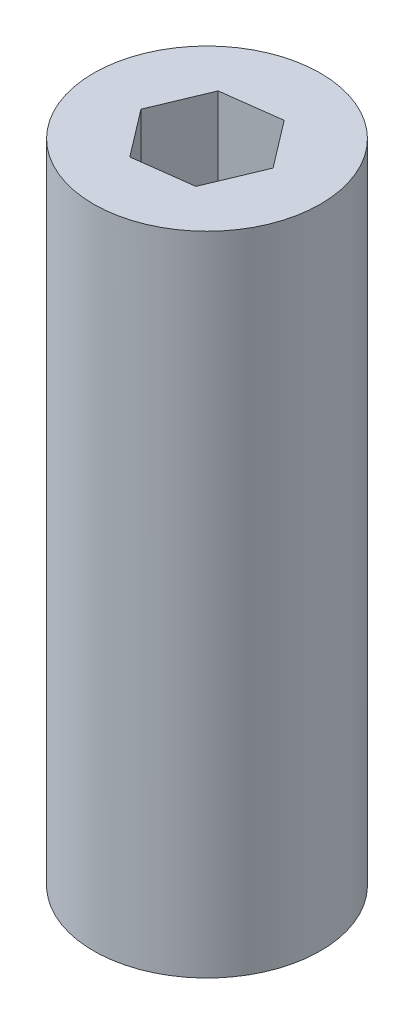
ISO-10303-21;
HEADER;
FILE_DESCRIPTION(('STEP AP214'),'2;1');
FILE_NAME('part.step','',(''),(''),'','','');
FILE_SCHEMA(('AUTOMOTIVE_DESIGN { 1 0 10303 214 1 1 1 1 }'));
ENDSEC;
DATA;
#1=APPLICATION_CONTEXT('core data for automotive mechanical design processes');
#2=APPLICATION_PROTOCOL_DEFINITION('international standard','automotive_design',2000,#1);
#3=PRODUCT_CONTEXT('',#1,'mechanical');
#4=PRODUCT('Part','Part','',(#3));
#5=PRODUCT_RELATED_PRODUCT_CATEGORY('part','',(#4));
#6=PRODUCT_DEFINITION_FORMATION('','',#4);
#7=PRODUCT_DEFINITION_CONTEXT('part definition',#1,'design');
#8=PRODUCT_DEFINITION('design','',#6,#7);
#9=PRODUCT_DEFINITION_SHAPE('','',#8);
#10=(LENGTH_UNIT() NAMED_UNIT(*) SI_UNIT(.MILLI.,.METRE.));
#11=(NAMED_UNIT(*) PLANE_ANGLE_UNIT() SI_UNIT($,.RADIAN.));
#12=(NAMED_UNIT(*) SI_UNIT($,.STERADIAN.) SOLID_ANGLE_UNIT());
#13=UNCERTAINTY_MEASURE_WITH_UNIT(LENGTH_MEASURE(1.E-05),#10,'distance_accuracy_value','');
#14=(GEOMETRIC_REPRESENTATION_CONTEXT(3) GLOBAL_UNCERTAINTY_ASSIGNED_CONTEXT((#13)) GLOBAL_UNIT_ASSIGNED_CONTEXT((#10,
#11,#12)) REPRESENTATION_CONTEXT('',''));
#15=CARTESIAN_POINT('',(0.,0.,0.));
#16=DIRECTION('',(0.,0.,1.));
#17=DIRECTION('',(1.,0.,0.));
#18=AXIS2_PLACEMENT_3D('',#15,#16,#17);
#19=CARTESIAN_POINT('',(0.288362155451006,8.,2.23312500037585));
#20=DIRECTION('',(-0.128066129287491,0.,-0.991765630846986));
#21=DIRECTION('',(-0.991765630846986,0.,0.128066129287492));
#22=AXIS2_PLACEMENT_3D('',#19,#20,#21);
#23=PLANE('',#22);
#24=DIRECTION('',(0.991765630846986,0.,-0.128066129287491));
#25=VECTOR('',#24,1.);
#26=CARTESIAN_POINT('',(0.288362155451006,0.,2.23312500037585));
#27=LINE('',#26,#25);
#28=CARTESIAN_POINT('',(-1.00093316465008,0.,2.39961096844959));
#29=VERTEX_POINT('',#28);
#30=CARTESIAN_POINT('',(1.57765747555209,0.,2.06663903230211));
#31=VERTEX_POINT('',#30);
#32=EDGE_CURVE('E146',#29,#31,#27,.T.);
#33=ORIENTED_EDGE('',*,*,#32,.F.);
#34=DIRECTION('',(0.,-1.,0.));
#35=VECTOR('',#34,1.);
#36=CARTESIAN_POINT('',(-1.00093316465008,8.,2.39961096844959));
#37=LINE('',#36,#35);
#38=CARTESIAN_POINT('',(-1.00093316465008,8.,2.39961096844959));
#39=VERTEX_POINT('',#38);
#40=EDGE_CURVE('E11',#39,#29,#37,.T.);
#41=ORIENTED_EDGE('',*,*,#40,.F.);
#42=DIRECTION('',(0.991765630846986,0.,-0.128066129287491));
#43=VECTOR('',#42,1.);
#44=CARTESIAN_POINT('',(0.288362155451006,8.,2.23312500037585));
#45=LINE('',#44,#43);
#46=CARTESIAN_POINT('',(1.57765747555209,8.,2.06663903230211));
#47=VERTEX_POINT('',#46);
#48=EDGE_CURVE('E168',#39,#47,#45,.T.);
#49=ORIENTED_EDGE('',*,*,#48,.T.);
#50=DIRECTION('',(0.,-1.,0.));
#51=VECTOR('',#50,1.);
#52=CARTESIAN_POINT('',(1.57765747555209,8.,2.06663903230211));
#53=LINE('',#52,#51);
#54=EDGE_CURVE('E70',#47,#31,#53,.T.);
#55=ORIENTED_EDGE('',*,*,#54,.T.);
#56=EDGE_LOOP('',(#33,#41,#49,#55));
#57=FACE_BOUND('',#56,.T.);
#58=ADVANCED_FACE('F47',(#57),#23,.T.);
#59=CARTESIAN_POINT('',(-1.78976190242612,8.,1.36629145229853));
#60=DIRECTION('',(0.794861166270044,0.,-0.606791336750803));
#61=DIRECTION('',(-0.606791336750803,0.,-0.794861166270044));
#62=AXIS2_PLACEMENT_3D('',#59,#60,#61);
#63=PLANE('',#62);
#64=DIRECTION('',(0.606791336750803,0.,0.794861166270044));
#65=VECTOR('',#64,1.);
#66=CARTESIAN_POINT('',(-1.78976190242612,0.,1.36629145229853));
#67=LINE('',#66,#65);
#68=CARTESIAN_POINT('',(-2.57859064020216,0.,0.332971936147478));
#69=VERTEX_POINT('',#68);
#70=EDGE_CURVE('E150',#69,#29,#67,.T.);
#71=ORIENTED_EDGE('',*,*,#70,.F.);
#72=DIRECTION('',(0.,-1.,0.));
#73=VECTOR('',#72,1.);
#74=CARTESIAN_POINT('',(-2.57859064020216,8.,0.332971936147478));
#75=LINE('',#74,#73);
#76=CARTESIAN_POINT('',(-2.57859064020216,8.,0.332971936147478));
#77=VERTEX_POINT('',#76);
#78=EDGE_CURVE('E55',#77,#69,#75,.T.);
#79=ORIENTED_EDGE('',*,*,#78,.F.);
#80=DIRECTION('',(0.606791336750803,0.,0.794861166270044));
#81=VECTOR('',#80,1.);
#82=CARTESIAN_POINT('',(-1.78976190242612,8.,1.36629145229853));
#83=LINE('',#82,#81);
#84=EDGE_CURVE('E185',#77,#39,#83,.T.);
#85=ORIENTED_EDGE('',*,*,#84,.T.);
#86=ORIENTED_EDGE('',*,*,#40,.T.);
#87=EDGE_LOOP('',(#71,#79,#85,#86));
#88=FACE_BOUND('',#87,.T.);
#89=ADVANCED_FACE('F181',(#88),#63,.T.);
#90=CARTESIAN_POINT('',(-2.07812405787712,8.,-0.866833548077317));
#91=DIRECTION('',(0.922927295557535,0.,0.384974294096183));
#92=DIRECTION('',(0.384974294096183,0.,-0.922927295557535));
#93=AXIS2_PLACEMENT_3D('',#90,#91,#92);
#94=PLANE('',#93);
#95=DIRECTION('',(-0.384974294096183,0.,0.922927295557535));
#96=VECTOR('',#95,1.);
#97=CARTESIAN_POINT('',(-2.07812405787712,0.,-0.866833548077317));
#98=LINE('',#97,#96);
#99=CARTESIAN_POINT('',(-1.57765747555209,0.,-2.06663903230211));
#100=VERTEX_POINT('',#99);
#101=EDGE_CURVE('E155',#100,#69,#98,.T.);
#102=ORIENTED_EDGE('',*,*,#101,.F.);
#103=DIRECTION('',(0.,-1.,0.));
#104=VECTOR('',#103,1.);
#105=CARTESIAN_POINT('',(-1.57765747555209,8.,-2.06663903230211));
#106=LINE('',#105,#104);
#107=CARTESIAN_POINT('',(-1.57765747555209,8.,-2.06663903230211));
#108=VERTEX_POINT('',#107);
#109=EDGE_CURVE('E119',#108,#100,#106,.T.);
#110=ORIENTED_EDGE('',*,*,#109,.F.);
#111=DIRECTION('',(-0.384974294096183,0.,0.922927295557535));
#112=VECTOR('',#111,1.);
#113=CARTESIAN_POINT('',(-2.07812405787712,8.,-0.866833548077317));
#114=LINE('',#113,#112);
#115=EDGE_CURVE('E131',#108,#77,#114,.T.);
#116=ORIENTED_EDGE('',*,*,#115,.T.);
#117=ORIENTED_EDGE('',*,*,#78,.T.);
#118=EDGE_LOOP('',(#102,#110,#116,#117));
#119=FACE_BOUND('',#118,.T.);
#120=ADVANCED_FACE('F178',(#119),#94,.T.);
#121=CARTESIAN_POINT('',(-0.288362155451006,8.,-2.23312500037585));
#122=DIRECTION('',(0.128066129287491,0.,0.991765630846986));
#123=DIRECTION('',(0.991765630846986,0.,-0.128066129287492));
#124=AXIS2_PLACEMENT_3D('',#121,#122,#123);
#125=PLANE('',#124);
#126=DIRECTION('',(-0.991765630846986,0.,0.128066129287491));
#127=VECTOR('',#126,1.);
#128=CARTESIAN_POINT('',(-0.288362155451006,0.,-2.23312500037585));
#129=LINE('',#128,#127);
#130=CARTESIAN_POINT('',(1.00093316465008,0.,-2.39961096844959));
#131=VERTEX_POINT('',#130);
#132=EDGE_CURVE('E113',#131,#100,#129,.T.);
#133=ORIENTED_EDGE('',*,*,#132,.F.);
#134=DIRECTION('',(0.,-1.,0.));
#135=VECTOR('',#134,1.);
#136=CARTESIAN_POINT('',(1.00093316465008,8.,-2.39961096844959));
#137=LINE('',#136,#135);
#138=CARTESIAN_POINT('',(1.00093316465008,8.,-2.39961096844959));
#139=VERTEX_POINT('',#138);
#140=EDGE_CURVE('E108',#139,#131,#137,.T.);
#141=ORIENTED_EDGE('',*,*,#140,.F.);
#142=DIRECTION('',(-0.991765630846986,0.,0.128066129287491));
#143=VECTOR('',#142,1.);
#144=CARTESIAN_POINT('',(-0.288362155451006,8.,-2.23312500037585));
#145=LINE('',#144,#143);
#146=EDGE_CURVE('E111',#139,#108,#145,.T.);
#147=ORIENTED_EDGE('',*,*,#146,.T.);
#148=ORIENTED_EDGE('',*,*,#109,.T.);
#149=EDGE_LOOP('',(#133,#141,#147,#148));
#150=FACE_BOUND('',#149,.T.);
#151=ADVANCED_FACE('F110',(#150),#125,.T.);
#152=CARTESIAN_POINT('',(1.78976190242612,8.,-1.36629145229853));
#153=DIRECTION('',(-0.794861166270044,0.,0.606791336750803));
#154=DIRECTION('',(0.606791336750803,0.,0.794861166270044));
#155=AXIS2_PLACEMENT_3D('',#152,#153,#154);
#156=PLANE('',#155);
#157=DIRECTION('',(-0.606791336750803,0.,-0.794861166270044));
#158=VECTOR('',#157,1.);
#159=CARTESIAN_POINT('',(1.78976190242612,0.,-1.36629145229853));
#160=LINE('',#159,#158);
#161=CARTESIAN_POINT('',(2.57859064020216,0.,-0.332971936147478));
#162=VERTEX_POINT('',#161);
#163=EDGE_CURVE('E161',#162,#131,#160,.T.);
#164=ORIENTED_EDGE('',*,*,#163,.F.);
#165=DIRECTION('',(0.,-1.,0.));
#166=VECTOR('',#165,1.);
#167=CARTESIAN_POINT('',(2.57859064020216,8.,-0.332971936147478));
#168=LINE('',#167,#166);
#169=CARTESIAN_POINT('',(2.57859064020216,8.,-0.332971936147478));
#170=VERTEX_POINT('',#169);
#171=EDGE_CURVE('E120',#170,#162,#168,.T.);
#172=ORIENTED_EDGE('',*,*,#171,.F.);
#173=DIRECTION('',(-0.606791336750803,0.,-0.794861166270044));
#174=VECTOR('',#173,1.);
#175=CARTESIAN_POINT('',(1.78976190242612,8.,-1.36629145229853));
#176=LINE('',#175,#174);
#177=EDGE_CURVE('E128',#170,#139,#176,.T.);
#178=ORIENTED_EDGE('',*,*,#177,.T.);
#179=ORIENTED_EDGE('',*,*,#140,.T.);
#180=EDGE_LOOP('',(#164,#172,#178,#179));
#181=FACE_BOUND('',#180,.T.);
#182=ADVANCED_FACE('F134',(#181),#156,.T.);
#183=CARTESIAN_POINT('',(2.07812405787713,8.,0.866833548077317));
#184=DIRECTION('',(-0.922927295557535,0.,-0.384974294096183));
#185=DIRECTION('',(-0.384974294096183,0.,0.922927295557535));
#186=AXIS2_PLACEMENT_3D('',#183,#184,#185);
#187=PLANE('',#186);
#188=DIRECTION('',(0.384974294096183,0.,-0.922927295557535));
#189=VECTOR('',#188,1.);
#190=CARTESIAN_POINT('',(2.07812405787713,0.,0.866833548077317));
#191=LINE('',#190,#189);
#192=EDGE_CURVE('E164',#31,#162,#191,.T.);
#193=ORIENTED_EDGE('',*,*,#192,.F.);
#194=ORIENTED_EDGE('',*,*,#54,.F.);
#195=DIRECTION('',(0.384974294096183,0.,-0.922927295557535));
#196=VECTOR('',#195,1.);
#197=CARTESIAN_POINT('',(2.07812405787713,8.,0.866833548077317));
#198=LINE('',#197,#196);
#199=EDGE_CURVE('E136',#47,#170,#198,.T.);
#200=ORIENTED_EDGE('',*,*,#199,.T.);
#201=ORIENTED_EDGE('',*,*,#171,.T.);
#202=EDGE_LOOP('',(#193,#194,#200,#201));
#203=FACE_BOUND('',#202,.T.);
#204=ADVANCED_FACE('F184',(#203),#187,.T.);
#205=CARTESIAN_POINT('',(0.,8.,0.));
#206=DIRECTION('',(0.,-1.,0.));
#207=DIRECTION('',(0.,0.,-1.));
#208=AXIS2_PLACEMENT_3D('',#205,#206,#207);
#209=CYLINDRICAL_SURFACE('',#208,5.);
#210=CARTESIAN_POINT('',(0.,8.,0.));
#211=DIRECTION('',(0.,1.,0.));
#212=DIRECTION('',(0.,0.,1.));
#213=AXIS2_PLACEMENT_3D('',#210,#211,#212);
#214=CIRCLE('',#213,5.);
#215=CARTESIAN_POINT('',(0.,8.,5.));
#216=VERTEX_POINT('',#215);
#217=EDGE_CURVE('E139',#216,#216,#214,.T.);
#218=ORIENTED_EDGE('',*,*,#217,.F.);
#219=EDGE_LOOP('',(#218));
#220=FACE_BOUND('',#219,.T.);
#221=CARTESIAN_POINT('',(0.,-20.5,0.));
#222=DIRECTION('',(0.,-1.,0.));
#223=DIRECTION('',(0.,0.,-1.));
#224=AXIS2_PLACEMENT_3D('',#221,#222,#223);
#225=CIRCLE('',#224,5.);
#226=CARTESIAN_POINT('',(0.,-20.5,-5.));
#227=VERTEX_POINT('',#226);
#228=EDGE_CURVE('E206',#227,#227,#225,.T.);
#229=ORIENTED_EDGE('',*,*,#228,.F.);
#230=EDGE_LOOP('',(#229));
#231=FACE_BOUND('',#230,.T.);
#232=ADVANCED_FACE('F264',(#220,#231),#209,.T.);
#233=CARTESIAN_POINT('',(0.,8.,0.));
#234=DIRECTION('',(0.,1.,0.));
#235=DIRECTION('',(0.,0.,1.));
#236=AXIS2_PLACEMENT_3D('',#233,#234,#235);
#237=PLANE('',#236);
#238=ORIENTED_EDGE('',*,*,#48,.F.);
#239=ORIENTED_EDGE('',*,*,#84,.F.);
#240=ORIENTED_EDGE('',*,*,#115,.F.);
#241=ORIENTED_EDGE('',*,*,#146,.F.);
#242=ORIENTED_EDGE('',*,*,#177,.F.);
#243=ORIENTED_EDGE('',*,*,#199,.F.);
#244=EDGE_LOOP('',(#238,#239,#240,#241,#242,#243));
#245=FACE_BOUND('',#244,.T.);
#246=ORIENTED_EDGE('',*,*,#217,.T.);
#247=EDGE_LOOP('',(#246));
#248=FACE_BOUND('',#247,.T.);
#249=ADVANCED_FACE('F125',(#245,#248),#237,.T.);
#250=CARTESIAN_POINT('',(0.,0.,0.));
#251=DIRECTION('',(0.,-1.,0.));
#252=DIRECTION('',(0.,0.,-1.));
#253=AXIS2_PLACEMENT_3D('',#250,#251,#252);
#254=PLANE('',#253);
#255=CARTESIAN_POINT('',(0.,0.,0.));
#256=DIRECTION('',(0.,-1.,0.));
#257=DIRECTION('',(0.,0.,-1.));
#258=AXIS2_PLACEMENT_3D('',#255,#256,#257);
#259=CIRCLE('',#258,2.175);
#260=CARTESIAN_POINT('',(0.,0.,-2.175));
#261=VERTEX_POINT('',#260);
#262=EDGE_CURVE('E151',#261,#261,#259,.T.);
#263=ORIENTED_EDGE('',*,*,#262,.T.);
#264=EDGE_LOOP('',(#263));
#265=FACE_BOUND('',#264,.T.);
#266=ORIENTED_EDGE('',*,*,#70,.T.);
#267=ORIENTED_EDGE('',*,*,#32,.T.);
#268=ORIENTED_EDGE('',*,*,#192,.T.);
#269=ORIENTED_EDGE('',*,*,#163,.T.);
#270=ORIENTED_EDGE('',*,*,#132,.T.);
#271=ORIENTED_EDGE('',*,*,#101,.T.);
#272=EDGE_LOOP('',(#266,#267,#268,#269,#270,#271));
#273=FACE_BOUND('',#272,.T.);
#274=ADVANCED_FACE('F183',(#265,#273),#254,.F.);
#275=CARTESIAN_POINT('',(0.,-6.,0.));
#276=DIRECTION('',(0.,1.,0.));
#277=DIRECTION('',(0.,0.,1.));
#278=AXIS2_PLACEMENT_3D('',#275,#276,#277);
#279=CYLINDRICAL_SURFACE('',#278,2.175);
#280=CARTESIAN_POINT('',(0.,-6.,0.));
#281=DIRECTION('',(0.,-1.,0.));
#282=DIRECTION('',(0.,0.,-1.));
#283=AXIS2_PLACEMENT_3D('',#280,#281,#282);
#284=CIRCLE('',#283,2.175);
#285=CARTESIAN_POINT('',(0.,-6.,-2.175));
#286=VERTEX_POINT('',#285);
#287=EDGE_CURVE('E195',#286,#286,#284,.T.);
#288=ORIENTED_EDGE('',*,*,#287,.T.);
#289=EDGE_LOOP('',(#288));
#290=FACE_BOUND('',#289,.T.);
#291=ORIENTED_EDGE('',*,*,#262,.F.);
#292=EDGE_LOOP('',(#291));
#293=FACE_BOUND('',#292,.T.);
#294=ADVANCED_FACE('F271',(#290,#293),#279,.F.);
#295=CARTESIAN_POINT('',(0.,-6.,0.));
#296=DIRECTION('',(0.,-1.,0.));
#297=DIRECTION('',(0.,0.,-1.));
#298=AXIS2_PLACEMENT_3D('',#295,#296,#297);
#299=PLANE('',#298);
#300=ORIENTED_EDGE('',*,*,#287,.F.);
#301=EDGE_LOOP('',(#300));
#302=FACE_BOUND('',#301,.T.);
#303=ADVANCED_FACE('F274',(#302),#299,.F.);
#304=CARTESIAN_POINT('',(0.,-20.5,2.5));
#305=DIRECTION('',(0.,0.,1.));
#306=DIRECTION('',(1.,0.,0.));
#307=AXIS2_PLACEMENT_3D('',#304,#305,#306);
#308=PLANE('',#307);
#309=DIRECTION('',(1.,0.,0.));
#310=VECTOR('',#309,1.);
#311=CARTESIAN_POINT('',(0.,-7.5,2.5));
#312=LINE('',#311,#310);
#313=CARTESIAN_POINT('',(-1.74714052096561,-7.5,2.5));
#314=VERTEX_POINT('',#313);
#315=CARTESIAN_POINT('',(1.74714052096561,-7.5,2.5));
#316=VERTEX_POINT('',#315);
#317=EDGE_CURVE('E210',#314,#316,#312,.T.);
#318=ORIENTED_EDGE('',*,*,#317,.T.);
#319=DIRECTION('',(0.,1.,0.));
#320=VECTOR('',#319,1.);
#321=CARTESIAN_POINT('',(1.74714052096561,-20.5,2.5));
#322=LINE('',#321,#320);
#323=CARTESIAN_POINT('',(1.74714052096561,-20.5,2.5));
#324=VERTEX_POINT('',#323);
#325=EDGE_CURVE('E199',#324,#316,#322,.T.);
#326=ORIENTED_EDGE('',*,*,#325,.F.);
#327=DIRECTION('',(1.,0.,0.));
#328=VECTOR('',#327,1.);
#329=CARTESIAN_POINT('',(0.,-20.5,2.5));
#330=LINE('',#329,#328);
#331=CARTESIAN_POINT('',(-1.74714052096561,-20.5,2.5));
#332=VERTEX_POINT('',#331);
#333=EDGE_CURVE('E209',#332,#324,#330,.T.);
#334=ORIENTED_EDGE('',*,*,#333,.F.);
#335=DIRECTION('',(0.,1.,0.));
#336=VECTOR('',#335,1.);
#337=CARTESIAN_POINT('',(-1.74714052096561,-20.5,2.5));
#338=LINE('',#337,#336);
#339=EDGE_CURVE('E202',#332,#314,#338,.T.);
#340=ORIENTED_EDGE('',*,*,#339,.T.);
#341=EDGE_LOOP('',(#318,#326,#334,#340));
#342=FACE_BOUND('',#341,.T.);
#343=ADVANCED_FACE('F234',(#342),#308,.F.);
#344=CARTESIAN_POINT('',(0.,-20.5,0.));
#345=DIRECTION('',(0.,1.,0.));
#346=DIRECTION('',(0.,0.,1.));
#347=AXIS2_PLACEMENT_3D('',#344,#345,#346);
#348=CYLINDRICAL_SURFACE('',#347,3.05);
#349=CARTESIAN_POINT('',(0.,-7.5,0.));
#350=DIRECTION('',(0.,-1.,0.));
#351=DIRECTION('',(0.,0.,-1.));
#352=AXIS2_PLACEMENT_3D('',#349,#350,#351);
#353=CIRCLE('',#352,3.05);
#354=EDGE_CURVE('E61',#314,#316,#353,.T.);
#355=ORIENTED_EDGE('',*,*,#354,.F.);
#356=ORIENTED_EDGE('',*,*,#339,.F.);
#357=CARTESIAN_POINT('',(0.,-20.5,0.));
#358=DIRECTION('',(0.,-1.,0.));
#359=DIRECTION('',(0.,0.,-1.));
#360=AXIS2_PLACEMENT_3D('',#357,#358,#359);
#361=CIRCLE('',#360,3.05);
#362=EDGE_CURVE('E217',#332,#324,#361,.T.);
#363=ORIENTED_EDGE('',*,*,#362,.T.);
#364=ORIENTED_EDGE('',*,*,#325,.T.);
#365=EDGE_LOOP('',(#355,#356,#363,#364));
#366=FACE_BOUND('',#365,.T.);
#367=ADVANCED_FACE('F237',(#366),#348,.F.);
#368=CARTESIAN_POINT('',(0.,-20.5,0.));
#369=DIRECTION('',(0.,-1.,0.));
#370=DIRECTION('',(0.,0.,-1.));
#371=AXIS2_PLACEMENT_3D('',#368,#369,#370);
#372=PLANE('',#371);
#373=ORIENTED_EDGE('',*,*,#333,.T.);
#374=ORIENTED_EDGE('',*,*,#362,.F.);
#375=EDGE_LOOP('',(#373,#374));
#376=FACE_BOUND('',#375,.T.);
#377=ORIENTED_EDGE('',*,*,#228,.T.);
#378=EDGE_LOOP('',(#377));
#379=FACE_BOUND('',#378,.T.);
#380=ADVANCED_FACE('F228',(#376,#379),#372,.T.);
#381=CARTESIAN_POINT('',(0.,-7.5,0.));
#382=DIRECTION('',(0.,-1.,0.));
#383=DIRECTION('',(0.,0.,-1.));
#384=AXIS2_PLACEMENT_3D('',#381,#382,#383);
#385=PLANE('',#384);
#386=ORIENTED_EDGE('',*,*,#354,.T.);
#387=ORIENTED_EDGE('',*,*,#317,.F.);
#388=EDGE_LOOP('',(#386,#387));
#389=FACE_BOUND('',#388,.T.);
#390=ADVANCED_FACE('F239',(#389),#385,.T.);
#391=CLOSED_SHELL('',(#58,#89,#120,#151,#182,#204,#232,#249,#274,#294,#303,#343,#367,#380,#390));
#392=MANIFOLD_SOLID_BREP('B2',#391);
#393=ADVANCED_BREP_SHAPE_REPRESENTATION('',(#18,#392),#14);
#394=SHAPE_DEFINITION_REPRESENTATION(#9,#393);
ENDSEC;
END-ISO-10303-21;
